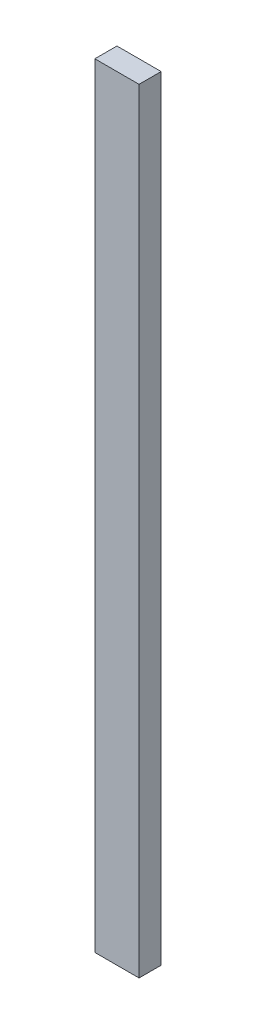
ISO-10303-21;
HEADER;
FILE_DESCRIPTION(('STEP AP214'),'2;1');
FILE_NAME('part.step','',(''),(''),'','','');
FILE_SCHEMA(('AUTOMOTIVE_DESIGN { 1 0 10303 214 1 1 1 1 }'));
ENDSEC;
DATA;
#1=APPLICATION_CONTEXT('core data for automotive mechanical design processes');
#2=APPLICATION_PROTOCOL_DEFINITION('international standard','automotive_design',2000,#1);
#3=PRODUCT_CONTEXT('',#1,'mechanical');
#4=PRODUCT('Part','Part','',(#3));
#5=PRODUCT_RELATED_PRODUCT_CATEGORY('part','',(#4));
#6=PRODUCT_DEFINITION_FORMATION('','',#4);
#7=PRODUCT_DEFINITION_CONTEXT('part definition',#1,'design');
#8=PRODUCT_DEFINITION('design','',#6,#7);
#9=PRODUCT_DEFINITION_SHAPE('','',#8);
#10=(LENGTH_UNIT() NAMED_UNIT(*) SI_UNIT(.MILLI.,.METRE.));
#11=(NAMED_UNIT(*) PLANE_ANGLE_UNIT() SI_UNIT($,.RADIAN.));
#12=(NAMED_UNIT(*) SI_UNIT($,.STERADIAN.) SOLID_ANGLE_UNIT());
#13=UNCERTAINTY_MEASURE_WITH_UNIT(LENGTH_MEASURE(1.E-05),#10,'distance_accuracy_value','');
#14=(GEOMETRIC_REPRESENTATION_CONTEXT(3) GLOBAL_UNCERTAINTY_ASSIGNED_CONTEXT((#13)) GLOBAL_UNIT_ASSIGNED_CONTEXT((#10,
#11,#12)) REPRESENTATION_CONTEXT('',''));
#15=CARTESIAN_POINT('',(0.,0.,0.));
#16=DIRECTION('',(0.,0.,1.));
#17=DIRECTION('',(1.,0.,0.));
#18=AXIS2_PLACEMENT_3D('',#15,#16,#17);
#19=CARTESIAN_POINT('',(25.4,889.,-12.7));
#20=DIRECTION('',(-1.,0.,0.));
#21=DIRECTION('',(0.,0.,1.));
#22=AXIS2_PLACEMENT_3D('',#19,#20,#21);
#23=PLANE('',#22);
#24=DIRECTION('',(0.,0.,-1.));
#25=VECTOR('',#24,1.);
#26=CARTESIAN_POINT('',(25.4,0.,-12.7));
#27=LINE('',#26,#25);
#28=CARTESIAN_POINT('',(25.4,0.,12.7));
#29=VERTEX_POINT('',#28);
#30=CARTESIAN_POINT('',(25.4,0.,-12.7));
#31=VERTEX_POINT('',#30);
#32=EDGE_CURVE('E107',#29,#31,#27,.T.);
#33=ORIENTED_EDGE('',*,*,#32,.T.);
#34=DIRECTION('',(0.,-1.,0.));
#35=VECTOR('',#34,1.);
#36=CARTESIAN_POINT('',(25.4,889.,-12.7));
#37=LINE('',#36,#35);
#38=CARTESIAN_POINT('',(25.4,889.,-12.7));
#39=VERTEX_POINT('',#38);
#40=EDGE_CURVE('E11',#39,#31,#37,.T.);
#41=ORIENTED_EDGE('',*,*,#40,.F.);
#42=DIRECTION('',(0.,0.,-1.));
#43=VECTOR('',#42,1.);
#44=CARTESIAN_POINT('',(25.4,889.,-12.7));
#45=LINE('',#44,#43);
#46=CARTESIAN_POINT('',(25.4,889.,12.7));
#47=VERTEX_POINT('',#46);
#48=EDGE_CURVE('E91',#47,#39,#45,.T.);
#49=ORIENTED_EDGE('',*,*,#48,.F.);
#50=DIRECTION('',(0.,-1.,0.));
#51=VECTOR('',#50,1.);
#52=CARTESIAN_POINT('',(25.4,889.,12.7));
#53=LINE('',#52,#51);
#54=EDGE_CURVE('E103',#47,#29,#53,.T.);
#55=ORIENTED_EDGE('',*,*,#54,.T.);
#56=EDGE_LOOP('',(#33,#41,#49,#55));
#57=FACE_BOUND('',#56,.T.);
#58=ADVANCED_FACE('F39',(#57),#23,.F.);
#59=CARTESIAN_POINT('',(-25.4,889.,-12.7));
#60=DIRECTION('',(0.,0.,1.));
#61=DIRECTION('',(1.,0.,0.));
#62=AXIS2_PLACEMENT_3D('',#59,#60,#61);
#63=PLANE('',#62);
#64=DIRECTION('',(-1.,0.,0.));
#65=VECTOR('',#64,1.);
#66=CARTESIAN_POINT('',(-25.4,0.,-12.7));
#67=LINE('',#66,#65);
#68=CARTESIAN_POINT('',(-25.4,0.,-12.7));
#69=VERTEX_POINT('',#68);
#70=EDGE_CURVE('E96',#31,#69,#67,.T.);
#71=ORIENTED_EDGE('',*,*,#70,.T.);
#72=DIRECTION('',(0.,-1.,0.));
#73=VECTOR('',#72,1.);
#74=CARTESIAN_POINT('',(-25.4,889.,-12.7));
#75=LINE('',#74,#73);
#76=CARTESIAN_POINT('',(-25.4,889.,-12.7));
#77=VERTEX_POINT('',#76);
#78=EDGE_CURVE('E48',#77,#69,#75,.T.);
#79=ORIENTED_EDGE('',*,*,#78,.F.);
#80=DIRECTION('',(-1.,0.,0.));
#81=VECTOR('',#80,1.);
#82=CARTESIAN_POINT('',(-25.4,889.,-12.7));
#83=LINE('',#82,#81);
#84=EDGE_CURVE('E86',#39,#77,#83,.T.);
#85=ORIENTED_EDGE('',*,*,#84,.F.);
#86=ORIENTED_EDGE('',*,*,#40,.T.);
#87=EDGE_LOOP('',(#71,#79,#85,#86));
#88=FACE_BOUND('',#87,.T.);
#89=ADVANCED_FACE('F95',(#88),#63,.F.);
#90=CARTESIAN_POINT('',(-25.4,889.,-12.7));
#91=DIRECTION('',(1.,0.,0.));
#92=DIRECTION('',(0.,0.,-1.));
#93=AXIS2_PLACEMENT_3D('',#90,#91,#92);
#94=PLANE('',#93);
#95=DIRECTION('',(0.,0.,1.));
#96=VECTOR('',#95,1.);
#97=CARTESIAN_POINT('',(-25.4,0.,-12.7));
#98=LINE('',#97,#96);
#99=CARTESIAN_POINT('',(-25.4,0.,12.7));
#100=VERTEX_POINT('',#99);
#101=EDGE_CURVE('E73',#69,#100,#98,.T.);
#102=ORIENTED_EDGE('',*,*,#101,.T.);
#103=DIRECTION('',(0.,-1.,0.));
#104=VECTOR('',#103,1.);
#105=CARTESIAN_POINT('',(-25.4,889.,12.7));
#106=LINE('',#105,#104);
#107=CARTESIAN_POINT('',(-25.4,889.,12.7));
#108=VERTEX_POINT('',#107);
#109=EDGE_CURVE('E98',#108,#100,#106,.T.);
#110=ORIENTED_EDGE('',*,*,#109,.F.);
#111=DIRECTION('',(0.,0.,1.));
#112=VECTOR('',#111,1.);
#113=CARTESIAN_POINT('',(-25.4,889.,-12.7));
#114=LINE('',#113,#112);
#115=EDGE_CURVE('E89',#77,#108,#114,.T.);
#116=ORIENTED_EDGE('',*,*,#115,.F.);
#117=ORIENTED_EDGE('',*,*,#78,.T.);
#118=EDGE_LOOP('',(#102,#110,#116,#117));
#119=FACE_BOUND('',#118,.T.);
#120=ADVANCED_FACE('F99',(#119),#94,.F.);
#121=CARTESIAN_POINT('',(-25.4,889.,12.7));
#122=DIRECTION('',(0.,0.,-1.));
#123=DIRECTION('',(-1.,0.,0.));
#124=AXIS2_PLACEMENT_3D('',#121,#122,#123);
#125=PLANE('',#124);
#126=DIRECTION('',(1.,0.,0.));
#127=VECTOR('',#126,1.);
#128=CARTESIAN_POINT('',(-25.4,0.,12.7));
#129=LINE('',#128,#127);
#130=EDGE_CURVE('E79',#100,#29,#129,.T.);
#131=ORIENTED_EDGE('',*,*,#130,.T.);
#132=ORIENTED_EDGE('',*,*,#54,.F.);
#133=DIRECTION('',(1.,0.,0.));
#134=VECTOR('',#133,1.);
#135=CARTESIAN_POINT('',(-25.4,889.,12.7));
#136=LINE('',#135,#134);
#137=EDGE_CURVE('E56',#108,#47,#136,.T.);
#138=ORIENTED_EDGE('',*,*,#137,.F.);
#139=ORIENTED_EDGE('',*,*,#109,.T.);
#140=EDGE_LOOP('',(#131,#132,#138,#139));
#141=FACE_BOUND('',#140,.T.);
#142=ADVANCED_FACE('F120',(#141),#125,.F.);
#143=CARTESIAN_POINT('',(0.,889.,0.));
#144=DIRECTION('',(0.,1.,0.));
#145=DIRECTION('',(0.,0.,1.));
#146=AXIS2_PLACEMENT_3D('',#143,#144,#145);
#147=PLANE('',#146);
#148=ORIENTED_EDGE('',*,*,#48,.T.);
#149=ORIENTED_EDGE('',*,*,#84,.T.);
#150=ORIENTED_EDGE('',*,*,#115,.T.);
#151=ORIENTED_EDGE('',*,*,#137,.T.);
#152=EDGE_LOOP('',(#148,#149,#150,#151));
#153=FACE_BOUND('',#152,.T.);
#154=ADVANCED_FACE('F87',(#153),#147,.T.);
#155=CARTESIAN_POINT('',(0.,0.,0.));
#156=DIRECTION('',(0.,1.,0.));
#157=DIRECTION('',(0.,0.,1.));
#158=AXIS2_PLACEMENT_3D('',#155,#156,#157);
#159=PLANE('',#158);
#160=ORIENTED_EDGE('',*,*,#32,.F.);
#161=ORIENTED_EDGE('',*,*,#130,.F.);
#162=ORIENTED_EDGE('',*,*,#101,.F.);
#163=ORIENTED_EDGE('',*,*,#70,.F.);
#164=EDGE_LOOP('',(#160,#161,#162,#163));
#165=FACE_BOUND('',#164,.T.);
#166=ADVANCED_FACE('F123',(#165),#159,.F.);
#167=CLOSED_SHELL('',(#58,#89,#120,#142,#154,#166));
#168=MANIFOLD_SOLID_BREP('B2',#167);
#169=ADVANCED_BREP_SHAPE_REPRESENTATION('',(#18,#168),#14);
#170=SHAPE_DEFINITION_REPRESENTATION(#9,#169);
ENDSEC;
END-ISO-10303-21;
